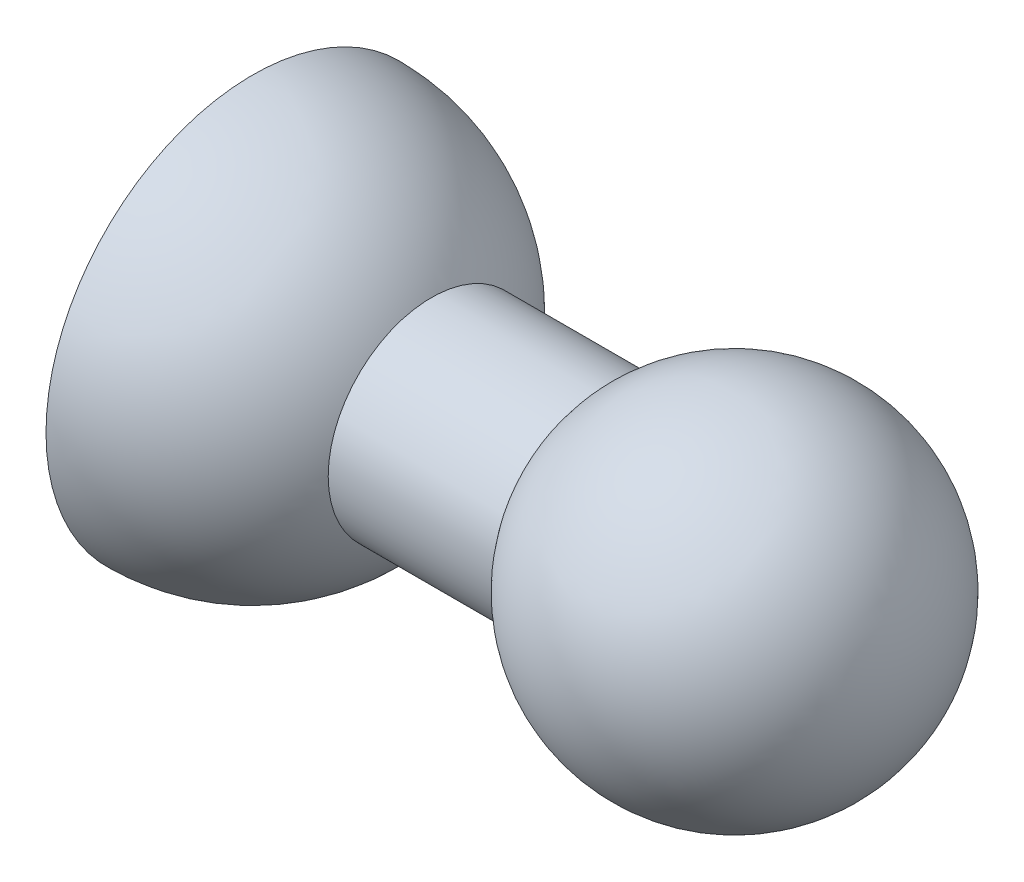
ISO-10303-21;
HEADER;
FILE_DESCRIPTION(('STEP AP214'),'2;1');
FILE_NAME('part.step','',(''),(''),'','','');
FILE_SCHEMA(('AUTOMOTIVE_DESIGN { 1 0 10303 214 1 1 1 1 }'));
ENDSEC;
DATA;
#1=APPLICATION_CONTEXT('core data for automotive mechanical design processes');
#2=APPLICATION_PROTOCOL_DEFINITION('international standard','automotive_design',2000,#1);
#3=PRODUCT_CONTEXT('',#1,'mechanical');
#4=PRODUCT('Part','Part','',(#3));
#5=PRODUCT_RELATED_PRODUCT_CATEGORY('part','',(#4));
#6=PRODUCT_DEFINITION_FORMATION('','',#4);
#7=PRODUCT_DEFINITION_CONTEXT('part definition',#1,'design');
#8=PRODUCT_DEFINITION('design','',#6,#7);
#9=PRODUCT_DEFINITION_SHAPE('','',#8);
#10=(LENGTH_UNIT() NAMED_UNIT(*) SI_UNIT(.MILLI.,.METRE.));
#11=(NAMED_UNIT(*) PLANE_ANGLE_UNIT() SI_UNIT($,.RADIAN.));
#12=(NAMED_UNIT(*) SI_UNIT($,.STERADIAN.) SOLID_ANGLE_UNIT());
#13=UNCERTAINTY_MEASURE_WITH_UNIT(LENGTH_MEASURE(1.E-05),#10,'distance_accuracy_value','');
#14=(GEOMETRIC_REPRESENTATION_CONTEXT(3) GLOBAL_UNCERTAINTY_ASSIGNED_CONTEXT((#13)) GLOBAL_UNIT_ASSIGNED_CONTEXT((#10,
#11,#12)) REPRESENTATION_CONTEXT('',''));
#15=CARTESIAN_POINT('',(0.,0.,0.));
#16=DIRECTION('',(0.,0.,1.));
#17=DIRECTION('',(1.,0.,0.));
#18=AXIS2_PLACEMENT_3D('',#15,#16,#17);
#19=CARTESIAN_POINT('',(0.,0.,0.));
#20=DIRECTION('',(-1.,0.,0.));
#21=DIRECTION('',(0.,0.,-1.));
#22=AXIS2_PLACEMENT_3D('',#19,#20,#21);
#23=SPHERICAL_SURFACE('',#22,30.);
#24=CARTESIAN_POINT('',(0.,0.,0.));
#25=DIRECTION('',(-1.,0.,0.));
#26=DIRECTION('',(0.,0.,1.));
#27=AXIS2_PLACEMENT_3D('',#24,#25,#26);
#28=CIRCLE('',#27,30.);
#29=CARTESIAN_POINT('',(0.,0.,30.));
#30=VERTEX_POINT('',#29);
#31=EDGE_CURVE('E50',#30,#30,#28,.T.);
#32=ORIENTED_EDGE('',*,*,#31,.F.);
#33=EDGE_LOOP('',(#32));
#34=FACE_BOUND('',#33,.T.);
#35=CARTESIAN_POINT('',(25.9807621135332,0.,0.));
#36=DIRECTION('',(-1.,0.,0.));
#37=DIRECTION('',(0.,0.,1.));
#38=AXIS2_PLACEMENT_3D('',#35,#36,#37);
#39=CIRCLE('',#38,15.);
#40=CARTESIAN_POINT('',(25.9807621135332,0.,15.));
#41=VERTEX_POINT('',#40);
#42=EDGE_CURVE('E10',#41,#41,#39,.F.);
#43=ORIENTED_EDGE('',*,*,#42,.F.);
#44=EDGE_LOOP('',(#43));
#45=FACE_BOUND('',#44,.T.);
#46=ADVANCED_FACE('F43',(#34,#45),#23,.T.);
#47=CARTESIAN_POINT('',(0.,0.,-25.));
#48=DIRECTION('',(-1.,0.,0.));
#49=DIRECTION('',(0.,0.,1.));
#50=AXIS2_PLACEMENT_3D('',#47,#48,#49);
#51=PLANE('',#50);
#52=ORIENTED_EDGE('',*,*,#31,.T.);
#53=EDGE_LOOP('',(#52));
#54=FACE_BOUND('',#53,.T.);
#55=CARTESIAN_POINT('',(0.,0.,0.));
#56=DIRECTION('',(-1.,0.,0.));
#57=DIRECTION('',(0.,0.,1.));
#58=AXIS2_PLACEMENT_3D('',#55,#56,#57);
#59=CIRCLE('',#58,25.);
#60=CARTESIAN_POINT('',(0.,0.,25.));
#61=VERTEX_POINT('',#60);
#62=EDGE_CURVE('E55',#61,#61,#59,.T.);
#63=ORIENTED_EDGE('',*,*,#62,.F.);
#64=EDGE_LOOP('',(#63));
#65=FACE_BOUND('',#64,.T.);
#66=ADVANCED_FACE('F78',(#54,#65),#51,.T.);
#67=CARTESIAN_POINT('',(0.,0.,0.));
#68=DIRECTION('',(-1.,0.,0.));
#69=DIRECTION('',(0.,0.,1.));
#70=AXIS2_PLACEMENT_3D('',#67,#68,#69);
#71=SPHERICAL_SURFACE('',#70,25.);
#72=ORIENTED_EDGE('',*,*,#62,.T.);
#73=EDGE_LOOP('',(#72));
#74=FACE_BOUND('',#73,.T.);
#75=ADVANCED_FACE('F75',(#74),#71,.F.);
#76=CARTESIAN_POINT('',(-30.001,0.,0.));
#77=DIRECTION('',(1.,0.,0.));
#78=DIRECTION('',(0.,0.,-1.));
#79=AXIS2_PLACEMENT_3D('',#76,#77,#78);
#80=CYLINDRICAL_SURFACE('',#79,15.);
#81=ORIENTED_EDGE('',*,*,#42,.T.);
#82=EDGE_LOOP('',(#81));
#83=FACE_BOUND('',#82,.T.);
#84=CARTESIAN_POINT('',(50.,0.,0.));
#85=DIRECTION('',(-1.,0.,0.));
#86=DIRECTION('',(0.,0.,1.));
#87=AXIS2_PLACEMENT_3D('',#84,#85,#86);
#88=CIRCLE('',#87,15.);
#89=CARTESIAN_POINT('',(50.,0.,15.));
#90=VERTEX_POINT('',#89);
#91=EDGE_CURVE('E60',#90,#90,#88,.T.);
#92=ORIENTED_EDGE('',*,*,#91,.T.);
#93=EDGE_LOOP('',(#92));
#94=FACE_BOUND('',#93,.T.);
#95=ADVANCED_FACE('F67',(#83,#94),#80,.T.);
#96=CARTESIAN_POINT('',(70.,0.,0.));
#97=DIRECTION('',(-1.,0.,0.));
#98=DIRECTION('',(0.,1.,0.));
#99=AXIS2_PLACEMENT_3D('',#96,#97,#98);
#100=SPHERICAL_SURFACE('',#99,25.);
#101=ORIENTED_EDGE('',*,*,#91,.F.);
#102=EDGE_LOOP('',(#101));
#103=FACE_BOUND('',#102,.T.);
#104=ADVANCED_FACE('F69',(#103),#100,.T.);
#105=CLOSED_SHELL('',(#46,#66,#75,#95,#104));
#106=MANIFOLD_SOLID_BREP('B2',#105);
#107=ADVANCED_BREP_SHAPE_REPRESENTATION('',(#18,#106),#14);
#108=SHAPE_DEFINITION_REPRESENTATION(#9,#107);
ENDSEC;
END-ISO-10303-21;
